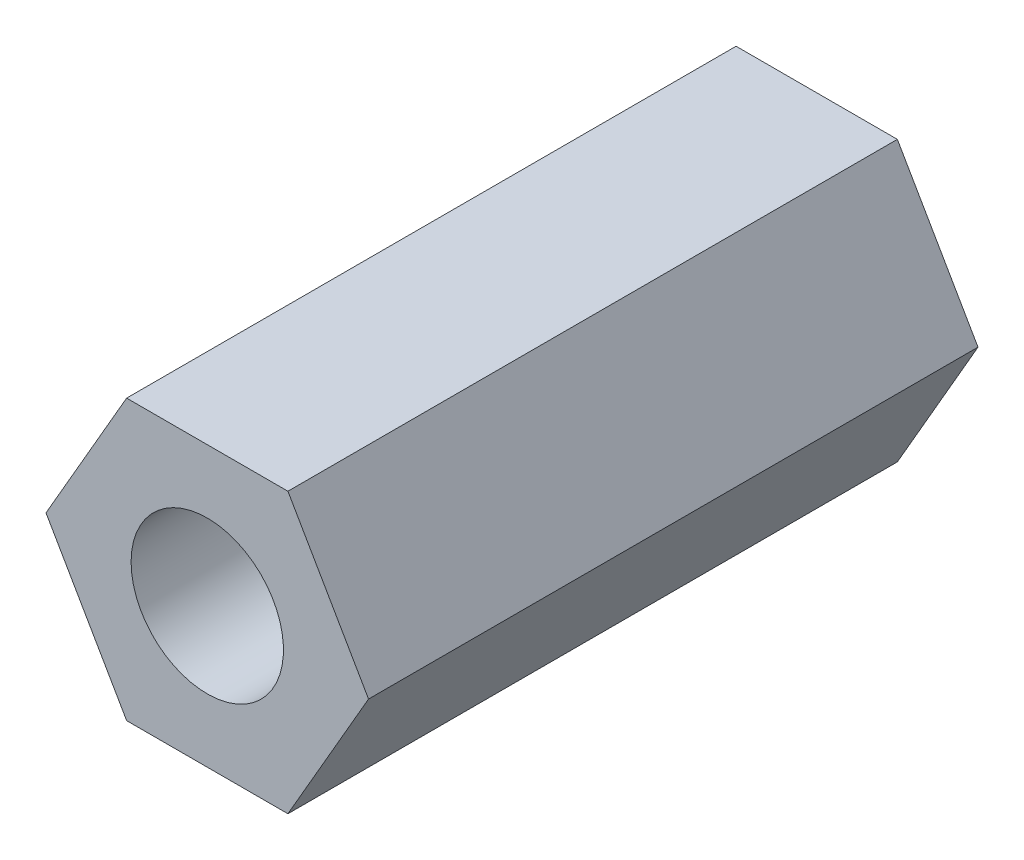
ISO-10303-21;
HEADER;
FILE_DESCRIPTION(('STEP AP214'),'2;1');
FILE_NAME('part.step','',(''),(''),'','','');
FILE_SCHEMA(('AUTOMOTIVE_DESIGN { 1 0 10303 214 1 1 1 1 }'));
ENDSEC;
DATA;
#1=APPLICATION_CONTEXT('core data for automotive mechanical design processes');
#2=APPLICATION_PROTOCOL_DEFINITION('international standard','automotive_design',2000,#1);
#3=PRODUCT_CONTEXT('',#1,'mechanical');
#4=PRODUCT('Part','Part','',(#3));
#5=PRODUCT_RELATED_PRODUCT_CATEGORY('part','',(#4));
#6=PRODUCT_DEFINITION_FORMATION('','',#4);
#7=PRODUCT_DEFINITION_CONTEXT('part definition',#1,'design');
#8=PRODUCT_DEFINITION('design','',#6,#7);
#9=PRODUCT_DEFINITION_SHAPE('','',#8);
#10=(LENGTH_UNIT() NAMED_UNIT(*) SI_UNIT(.MILLI.,.METRE.));
#11=(NAMED_UNIT(*) PLANE_ANGLE_UNIT() SI_UNIT($,.RADIAN.));
#12=(NAMED_UNIT(*) SI_UNIT($,.STERADIAN.) SOLID_ANGLE_UNIT());
#13=UNCERTAINTY_MEASURE_WITH_UNIT(LENGTH_MEASURE(1.E-05),#10,'distance_accuracy_value','');
#14=(GEOMETRIC_REPRESENTATION_CONTEXT(3) GLOBAL_UNCERTAINTY_ASSIGNED_CONTEXT((#13)) GLOBAL_UNIT_ASSIGNED_CONTEXT((#10,
#11,#12)) REPRESENTATION_CONTEXT('',''));
#15=CARTESIAN_POINT('',(0.,0.,0.));
#16=DIRECTION('',(0.,0.,1.));
#17=DIRECTION('',(1.,0.,0.));
#18=AXIS2_PLACEMENT_3D('',#15,#16,#17);
#19=CARTESIAN_POINT('',(3.17542648054294,0.,12.));
#20=DIRECTION('',(-0.866025403784439,-0.5,0.));
#21=DIRECTION('',(0.5,-0.866025403784439,0.));
#22=AXIS2_PLACEMENT_3D('',#19,#20,#21);
#23=PLANE('',#22);
#24=DIRECTION('',(-0.5,0.866025403784439,0.));
#25=VECTOR('',#24,1.);
#26=CARTESIAN_POINT('',(3.17542648054293,0.,0.));
#27=LINE('',#26,#25);
#28=CARTESIAN_POINT('',(3.17542648054293,0.,0.));
#29=VERTEX_POINT('',#28);
#30=CARTESIAN_POINT('',(1.58771324027147,2.75,0.));
#31=VERTEX_POINT('',#30);
#32=EDGE_CURVE('E114',#29,#31,#27,.T.);
#33=ORIENTED_EDGE('',*,*,#32,.T.);
#34=DIRECTION('',(0.,0.,-1.));
#35=VECTOR('',#34,1.);
#36=CARTESIAN_POINT('',(1.58771324027147,2.75,12.));
#37=LINE('',#36,#35);
#38=CARTESIAN_POINT('',(1.58771324027147,2.75,12.));
#39=VERTEX_POINT('',#38);
#40=EDGE_CURVE('E11',#39,#31,#37,.T.);
#41=ORIENTED_EDGE('',*,*,#40,.F.);
#42=DIRECTION('',(-0.5,0.866025403784439,0.));
#43=VECTOR('',#42,1.);
#44=CARTESIAN_POINT('',(3.17542648054294,0.,12.));
#45=LINE('',#44,#43);
#46=CARTESIAN_POINT('',(3.17542648054294,0.,12.));
#47=VERTEX_POINT('',#46);
#48=EDGE_CURVE('E125',#47,#39,#45,.T.);
#49=ORIENTED_EDGE('',*,*,#48,.F.);
#50=DIRECTION('',(0.,0.,-1.));
#51=VECTOR('',#50,1.);
#52=CARTESIAN_POINT('',(3.17542648054294,0.,12.));
#53=LINE('',#52,#51);
#54=EDGE_CURVE('E110',#47,#29,#53,.T.);
#55=ORIENTED_EDGE('',*,*,#54,.T.);
#56=EDGE_LOOP('',(#33,#41,#49,#55));
#57=FACE_BOUND('',#56,.T.);
#58=ADVANCED_FACE('F30',(#57),#23,.F.);
#59=CARTESIAN_POINT('',(1.58771324027147,2.75,12.));
#60=DIRECTION('',(0.,-1.,0.));
#61=DIRECTION('',(0.,0.,-1.));
#62=AXIS2_PLACEMENT_3D('',#59,#60,#61);
#63=PLANE('',#62);
#64=DIRECTION('',(-1.,0.,0.));
#65=VECTOR('',#64,1.);
#66=CARTESIAN_POINT('',(1.58771324027147,2.75,0.));
#67=LINE('',#66,#65);
#68=CARTESIAN_POINT('',(-1.58771324027148,2.75000000000003,0.));
#69=VERTEX_POINT('',#68);
#70=EDGE_CURVE('E117',#31,#69,#67,.T.);
#71=ORIENTED_EDGE('',*,*,#70,.T.);
#72=DIRECTION('',(0.,0.,-1.));
#73=VECTOR('',#72,1.);
#74=CARTESIAN_POINT('',(-1.58771324027147,2.75,12.));
#75=LINE('',#74,#73);
#76=CARTESIAN_POINT('',(-1.58771324027147,2.75,12.));
#77=VERTEX_POINT('',#76);
#78=EDGE_CURVE('E38',#77,#69,#75,.T.);
#79=ORIENTED_EDGE('',*,*,#78,.F.);
#80=DIRECTION('',(-1.,0.,0.));
#81=VECTOR('',#80,1.);
#82=CARTESIAN_POINT('',(1.58771324027147,2.75,12.));
#83=LINE('',#82,#81);
#84=EDGE_CURVE('E83',#39,#77,#83,.T.);
#85=ORIENTED_EDGE('',*,*,#84,.F.);
#86=ORIENTED_EDGE('',*,*,#40,.T.);
#87=EDGE_LOOP('',(#71,#79,#85,#86));
#88=FACE_BOUND('',#87,.T.);
#89=ADVANCED_FACE('F150',(#88),#63,.F.);
#90=CARTESIAN_POINT('',(-1.58771324027147,2.75,12.));
#91=DIRECTION('',(0.866025403784439,-0.5,0.));
#92=DIRECTION('',(0.5,0.866025403784439,0.));
#93=AXIS2_PLACEMENT_3D('',#90,#91,#92);
#94=PLANE('',#93);
#95=DIRECTION('',(-0.5,-0.866025403784439,0.));
#96=VECTOR('',#95,1.);
#97=CARTESIAN_POINT('',(-1.58771324027148,2.75000000000003,0.));
#98=LINE('',#97,#96);
#99=CARTESIAN_POINT('',(-3.17542648054294,0.,0.));
#100=VERTEX_POINT('',#99);
#101=EDGE_CURVE('E120',#69,#100,#98,.T.);
#102=ORIENTED_EDGE('',*,*,#101,.T.);
#103=DIRECTION('',(0.,0.,-1.));
#104=VECTOR('',#103,1.);
#105=CARTESIAN_POINT('',(-3.17542648054294,0.,12.));
#106=LINE('',#105,#104);
#107=CARTESIAN_POINT('',(-3.17542648054294,0.,12.));
#108=VERTEX_POINT('',#107);
#109=EDGE_CURVE('E105',#108,#100,#106,.T.);
#110=ORIENTED_EDGE('',*,*,#109,.F.);
#111=DIRECTION('',(-0.5,-0.866025403784439,0.));
#112=VECTOR('',#111,1.);
#113=CARTESIAN_POINT('',(-1.58771324027147,2.75,12.));
#114=LINE('',#113,#112);
#115=EDGE_CURVE('E96',#77,#108,#114,.T.);
#116=ORIENTED_EDGE('',*,*,#115,.F.);
#117=ORIENTED_EDGE('',*,*,#78,.T.);
#118=EDGE_LOOP('',(#102,#110,#116,#117));
#119=FACE_BOUND('',#118,.T.);
#120=ADVANCED_FACE('F131',(#119),#94,.F.);
#121=CARTESIAN_POINT('',(-3.17542648054294,0.,12.));
#122=DIRECTION('',(0.866025403784439,0.5,0.));
#123=DIRECTION('',(-0.5,0.866025403784439,0.));
#124=AXIS2_PLACEMENT_3D('',#121,#122,#123);
#125=PLANE('',#124);
#126=DIRECTION('',(0.5,-0.866025403784439,0.));
#127=VECTOR('',#126,1.);
#128=CARTESIAN_POINT('',(-3.17542648054294,0.,0.));
#129=LINE('',#128,#127);
#130=CARTESIAN_POINT('',(-1.58771324027147,-2.74999999999997,0.));
#131=VERTEX_POINT('',#130);
#132=EDGE_CURVE('E104',#100,#131,#129,.T.);
#133=ORIENTED_EDGE('',*,*,#132,.T.);
#134=DIRECTION('',(0.,0.,-1.));
#135=VECTOR('',#134,1.);
#136=CARTESIAN_POINT('',(-1.58771324027148,-2.75,12.));
#137=LINE('',#136,#135);
#138=CARTESIAN_POINT('',(-1.58771324027148,-2.75,12.));
#139=VERTEX_POINT('',#138);
#140=EDGE_CURVE('E101',#139,#131,#137,.T.);
#141=ORIENTED_EDGE('',*,*,#140,.F.);
#142=DIRECTION('',(0.5,-0.866025403784439,0.));
#143=VECTOR('',#142,1.);
#144=CARTESIAN_POINT('',(-3.17542648054294,0.,12.));
#145=LINE('',#144,#143);
#146=EDGE_CURVE('E90',#108,#139,#145,.T.);
#147=ORIENTED_EDGE('',*,*,#146,.F.);
#148=ORIENTED_EDGE('',*,*,#109,.T.);
#149=EDGE_LOOP('',(#133,#141,#147,#148));
#150=FACE_BOUND('',#149,.T.);
#151=ADVANCED_FACE('F102',(#150),#125,.F.);
#152=CARTESIAN_POINT('',(-1.58771324027148,-2.75,12.));
#153=DIRECTION('',(0.,1.,0.));
#154=DIRECTION('',(0.,0.,1.));
#155=AXIS2_PLACEMENT_3D('',#152,#153,#154);
#156=PLANE('',#155);
#157=DIRECTION('',(1.,0.,0.));
#158=VECTOR('',#157,1.);
#159=CARTESIAN_POINT('',(-1.58771324027147,-2.74999999999997,0.));
#160=LINE('',#159,#158);
#161=CARTESIAN_POINT('',(1.58771324027147,-2.75,0.));
#162=VERTEX_POINT('',#161);
#163=EDGE_CURVE('E69',#131,#162,#160,.T.);
#164=ORIENTED_EDGE('',*,*,#163,.T.);
#165=DIRECTION('',(0.,0.,-1.));
#166=VECTOR('',#165,1.);
#167=CARTESIAN_POINT('',(1.58771324027147,-2.75,12.));
#168=LINE('',#167,#166);
#169=CARTESIAN_POINT('',(1.58771324027147,-2.75,12.));
#170=VERTEX_POINT('',#169);
#171=EDGE_CURVE('E106',#170,#162,#168,.T.);
#172=ORIENTED_EDGE('',*,*,#171,.F.);
#173=DIRECTION('',(1.,0.,0.));
#174=VECTOR('',#173,1.);
#175=CARTESIAN_POINT('',(-1.58771324027148,-2.75,12.));
#176=LINE('',#175,#174);
#177=EDGE_CURVE('E94',#139,#170,#176,.T.);
#178=ORIENTED_EDGE('',*,*,#177,.F.);
#179=ORIENTED_EDGE('',*,*,#140,.T.);
#180=EDGE_LOOP('',(#164,#172,#178,#179));
#181=FACE_BOUND('',#180,.T.);
#182=ADVANCED_FACE('F108',(#181),#156,.F.);
#183=CARTESIAN_POINT('',(1.58771324027147,-2.75,12.));
#184=DIRECTION('',(-0.866025403784439,0.5,0.));
#185=DIRECTION('',(-0.5,-0.866025403784439,0.));
#186=AXIS2_PLACEMENT_3D('',#183,#184,#185);
#187=PLANE('',#186);
#188=DIRECTION('',(0.5,0.866025403784439,0.));
#189=VECTOR('',#188,1.);
#190=CARTESIAN_POINT('',(1.58771324027147,-2.75,0.));
#191=LINE('',#190,#189);
#192=EDGE_CURVE('E75',#162,#29,#191,.T.);
#193=ORIENTED_EDGE('',*,*,#192,.T.);
#194=ORIENTED_EDGE('',*,*,#54,.F.);
#195=DIRECTION('',(0.5,0.866025403784439,0.));
#196=VECTOR('',#195,1.);
#197=CARTESIAN_POINT('',(1.58771324027147,-2.75,12.));
#198=LINE('',#197,#196);
#199=EDGE_CURVE('E46',#170,#47,#198,.T.);
#200=ORIENTED_EDGE('',*,*,#199,.F.);
#201=ORIENTED_EDGE('',*,*,#171,.T.);
#202=EDGE_LOOP('',(#193,#194,#200,#201));
#203=FACE_BOUND('',#202,.T.);
#204=ADVANCED_FACE('F138',(#203),#187,.F.);
#205=CARTESIAN_POINT('',(3.17542648054294,0.,12.));
#206=DIRECTION('',(0.,0.,-1.));
#207=DIRECTION('',(-1.,0.,0.));
#208=AXIS2_PLACEMENT_3D('',#205,#206,#207);
#209=PLANE('',#208);
#210=CARTESIAN_POINT('',(0.,0.,12.));
#211=DIRECTION('',(0.,0.,-1.));
#212=DIRECTION('',(-1.,0.,0.));
#213=AXIS2_PLACEMENT_3D('',#210,#211,#212);
#214=CIRCLE('',#213,1.5);
#215=CARTESIAN_POINT('',(-1.5,0.,12.));
#216=VERTEX_POINT('',#215);
#217=EDGE_CURVE('E118',#216,#216,#214,.T.);
#218=ORIENTED_EDGE('',*,*,#217,.T.);
#219=EDGE_LOOP('',(#218));
#220=FACE_BOUND('',#219,.T.);
#221=ORIENTED_EDGE('',*,*,#48,.T.);
#222=ORIENTED_EDGE('',*,*,#84,.T.);
#223=ORIENTED_EDGE('',*,*,#115,.T.);
#224=ORIENTED_EDGE('',*,*,#146,.T.);
#225=ORIENTED_EDGE('',*,*,#177,.T.);
#226=ORIENTED_EDGE('',*,*,#199,.T.);
#227=EDGE_LOOP('',(#221,#222,#223,#224,#225,#226));
#228=FACE_BOUND('',#227,.T.);
#229=ADVANCED_FACE('F92',(#220,#228),#209,.F.);
#230=CARTESIAN_POINT('',(3.17542648054293,0.,0.));
#231=DIRECTION('',(0.,0.,-1.));
#232=DIRECTION('',(-1.,0.,0.));
#233=AXIS2_PLACEMENT_3D('',#230,#231,#232);
#234=PLANE('',#233);
#235=CARTESIAN_POINT('',(0.,0.,0.));
#236=DIRECTION('',(0.,0.,-1.));
#237=DIRECTION('',(-1.,0.,0.));
#238=AXIS2_PLACEMENT_3D('',#235,#236,#237);
#239=CIRCLE('',#238,1.5);
#240=CARTESIAN_POINT('',(-1.5,0.,0.));
#241=VERTEX_POINT('',#240);
#242=EDGE_CURVE('E205',#241,#241,#239,.T.);
#243=ORIENTED_EDGE('',*,*,#242,.F.);
#244=EDGE_LOOP('',(#243));
#245=FACE_BOUND('',#244,.T.);
#246=ORIENTED_EDGE('',*,*,#32,.F.);
#247=ORIENTED_EDGE('',*,*,#192,.F.);
#248=ORIENTED_EDGE('',*,*,#163,.F.);
#249=ORIENTED_EDGE('',*,*,#132,.F.);
#250=ORIENTED_EDGE('',*,*,#101,.F.);
#251=ORIENTED_EDGE('',*,*,#70,.F.);
#252=EDGE_LOOP('',(#246,#247,#248,#249,#250,#251));
#253=FACE_BOUND('',#252,.T.);
#254=ADVANCED_FACE('F134',(#245,#253),#234,.T.);
#255=CARTESIAN_POINT('',(0.,0.,12.));
#256=DIRECTION('',(0.,0.,-1.));
#257=DIRECTION('',(-1.,0.,0.));
#258=AXIS2_PLACEMENT_3D('',#255,#256,#257);
#259=CYLINDRICAL_SURFACE('',#258,1.5);
#260=ORIENTED_EDGE('',*,*,#217,.F.);
#261=EDGE_LOOP('',(#260));
#262=FACE_BOUND('',#261,.T.);
#263=ORIENTED_EDGE('',*,*,#242,.T.);
#264=EDGE_LOOP('',(#263));
#265=FACE_BOUND('',#264,.T.);
#266=ADVANCED_FACE('F187',(#262,#265),#259,.F.);
#267=CLOSED_SHELL('',(#58,#89,#120,#151,#182,#204,#229,#254,#266));
#268=MANIFOLD_SOLID_BREP('B2',#267);
#269=ADVANCED_BREP_SHAPE_REPRESENTATION('',(#18,#268),#14);
#270=SHAPE_DEFINITION_REPRESENTATION(#9,#269);
ENDSEC;
END-ISO-10303-21;
